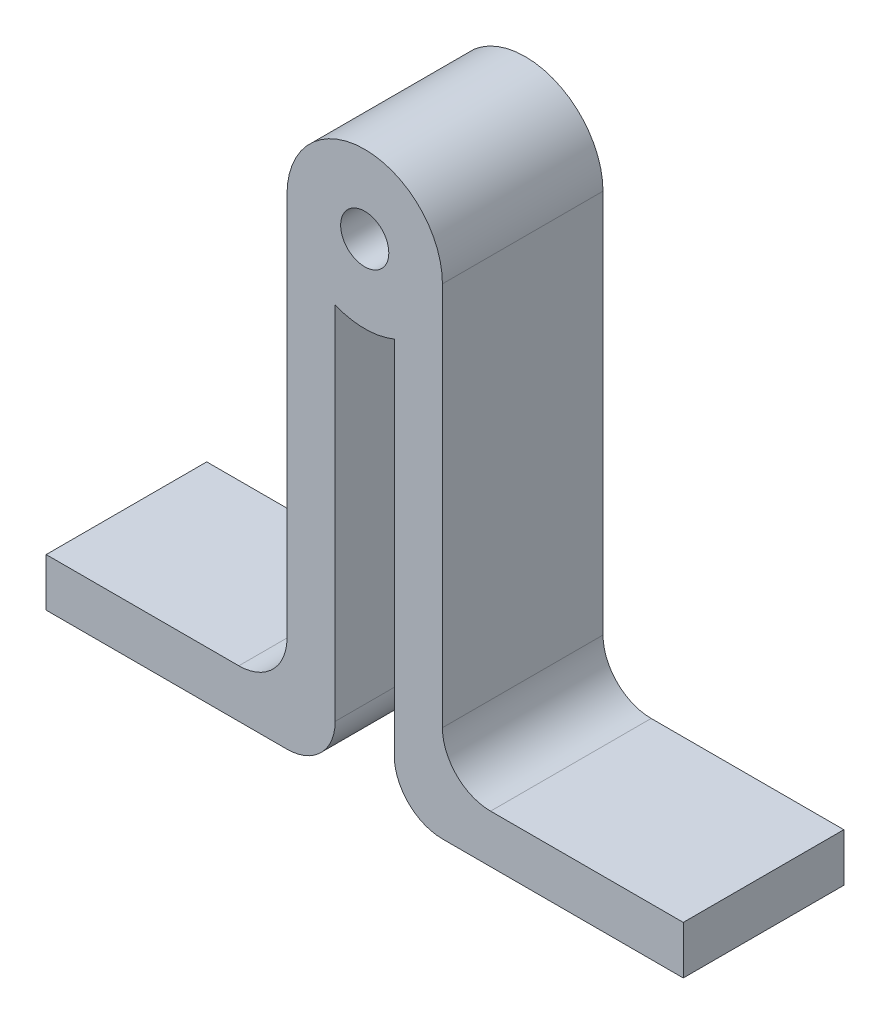
ISO-10303-21;
HEADER;
FILE_DESCRIPTION(('STEP AP214'),'2;1');
FILE_NAME('part.step','',(''),(''),'','','');
FILE_SCHEMA(('AUTOMOTIVE_DESIGN { 1 0 10303 214 1 1 1 1 }'));
ENDSEC;
DATA;
#1=APPLICATION_CONTEXT('core data for automotive mechanical design processes');
#2=APPLICATION_PROTOCOL_DEFINITION('international standard','automotive_design',2000,#1);
#3=PRODUCT_CONTEXT('',#1,'mechanical');
#4=PRODUCT('Part','Part','',(#3));
#5=PRODUCT_RELATED_PRODUCT_CATEGORY('part','',(#4));
#6=PRODUCT_DEFINITION_FORMATION('','',#4);
#7=PRODUCT_DEFINITION_CONTEXT('part definition',#1,'design');
#8=PRODUCT_DEFINITION('design','',#6,#7);
#9=PRODUCT_DEFINITION_SHAPE('','',#8);
#10=(LENGTH_UNIT() NAMED_UNIT(*) SI_UNIT(.MILLI.,.METRE.));
#11=(NAMED_UNIT(*) PLANE_ANGLE_UNIT() SI_UNIT($,.RADIAN.));
#12=(NAMED_UNIT(*) SI_UNIT($,.STERADIAN.) SOLID_ANGLE_UNIT());
#13=UNCERTAINTY_MEASURE_WITH_UNIT(LENGTH_MEASURE(1.E-05),#10,'distance_accuracy_value','');
#14=(GEOMETRIC_REPRESENTATION_CONTEXT(3) GLOBAL_UNCERTAINTY_ASSIGNED_CONTEXT((#13)) GLOBAL_UNIT_ASSIGNED_CONTEXT((#10,
#11,#12)) REPRESENTATION_CONTEXT('',''));
#15=CARTESIAN_POINT('',(0.,0.,0.));
#16=DIRECTION('',(0.,0.,1.));
#17=DIRECTION('',(1.,0.,0.));
#18=AXIS2_PLACEMENT_3D('',#15,#16,#17);
#19=CARTESIAN_POINT('',(1.84,0.,10.));
#20=DIRECTION('',(-1.,0.,0.));
#21=DIRECTION('',(0.,-1.,0.));
#22=AXIS2_PLACEMENT_3D('',#19,#20,#21);
#23=PLANE('',#22);
#24=DIRECTION('',(0.,1.,0.));
#25=VECTOR('',#24,1.);
#26=CARTESIAN_POINT('',(1.84,0.,0.));
#27=LINE('',#26,#25);
#28=CARTESIAN_POINT('',(1.84,-26.94,0.));
#29=VERTEX_POINT('',#28);
#30=CARTESIAN_POINT('',(1.84,-4.47660585711988,0.));
#31=VERTEX_POINT('',#30);
#32=EDGE_CURVE('E200',#29,#31,#27,.T.);
#33=ORIENTED_EDGE('',*,*,#32,.F.);
#34=DIRECTION('',(0.,0.,-1.));
#35=VECTOR('',#34,1.);
#36=CARTESIAN_POINT('',(1.84,-26.94,10.));
#37=LINE('',#36,#35);
#38=CARTESIAN_POINT('',(1.84,-26.94,10.));
#39=VERTEX_POINT('',#38);
#40=EDGE_CURVE('E11',#39,#29,#37,.T.);
#41=ORIENTED_EDGE('',*,*,#40,.F.);
#42=DIRECTION('',(0.,1.,0.));
#43=VECTOR('',#42,1.);
#44=CARTESIAN_POINT('',(1.84,0.,10.));
#45=LINE('',#44,#43);
#46=CARTESIAN_POINT('',(1.84,-4.47660585711988,10.));
#47=VERTEX_POINT('',#46);
#48=EDGE_CURVE('E258',#39,#47,#45,.T.);
#49=ORIENTED_EDGE('',*,*,#48,.T.);
#50=DIRECTION('',(0.,0.,-1.));
#51=VECTOR('',#50,1.);
#52=CARTESIAN_POINT('',(1.84,-4.47660585711988,10.));
#53=LINE('',#52,#51);
#54=EDGE_CURVE('E122',#47,#31,#53,.T.);
#55=ORIENTED_EDGE('',*,*,#54,.T.);
#56=EDGE_LOOP('',(#33,#41,#49,#55));
#57=FACE_BOUND('',#56,.T.);
#58=ADVANCED_FACE('F50',(#57),#23,.T.);
#59=CARTESIAN_POINT('',(4.84,-26.94,10.));
#60=DIRECTION('',(0.,0.,-1.));
#61=DIRECTION('',(-1.,0.,0.));
#62=AXIS2_PLACEMENT_3D('',#59,#60,#61);
#63=CYLINDRICAL_SURFACE('',#62,3.);
#64=CARTESIAN_POINT('',(4.84,-26.94,0.));
#65=DIRECTION('',(0.,0.,1.));
#66=DIRECTION('',(1.,0.,0.));
#67=AXIS2_PLACEMENT_3D('',#64,#65,#66);
#68=CIRCLE('',#67,3.);
#69=CARTESIAN_POINT('',(4.84,-29.94,0.));
#70=VERTEX_POINT('',#69);
#71=EDGE_CURVE('E205',#29,#70,#68,.T.);
#72=ORIENTED_EDGE('',*,*,#71,.T.);
#73=DIRECTION('',(0.,0.,-1.));
#74=VECTOR('',#73,1.);
#75=CARTESIAN_POINT('',(4.84,-29.94,10.));
#76=LINE('',#75,#74);
#77=CARTESIAN_POINT('',(4.84,-29.94,10.));
#78=VERTEX_POINT('',#77);
#79=EDGE_CURVE('E57',#78,#70,#76,.T.);
#80=ORIENTED_EDGE('',*,*,#79,.F.);
#81=CARTESIAN_POINT('',(4.84,-26.94,10.));
#82=DIRECTION('',(0.,0.,1.));
#83=DIRECTION('',(1.,0.,0.));
#84=AXIS2_PLACEMENT_3D('',#81,#82,#83);
#85=CIRCLE('',#84,3.);
#86=EDGE_CURVE('E317',#39,#78,#85,.T.);
#87=ORIENTED_EDGE('',*,*,#86,.F.);
#88=ORIENTED_EDGE('',*,*,#40,.T.);
#89=EDGE_LOOP('',(#72,#80,#87,#88));
#90=FACE_BOUND('',#89,.T.);
#91=ADVANCED_FACE('F304',(#90),#63,.T.);
#92=CARTESIAN_POINT('',(0.,-29.94,10.));
#93=DIRECTION('',(0.,-1.,0.));
#94=DIRECTION('',(1.,0.,0.));
#95=AXIS2_PLACEMENT_3D('',#92,#93,#94);
#96=PLANE('',#95);
#97=DIRECTION('',(-1.,0.,0.));
#98=VECTOR('',#97,1.);
#99=CARTESIAN_POINT('',(0.,-29.94,0.));
#100=LINE('',#99,#98);
#101=CARTESIAN_POINT('',(19.84,-29.94,0.));
#102=VERTEX_POINT('',#101);
#103=EDGE_CURVE('E207',#102,#70,#100,.T.);
#104=ORIENTED_EDGE('',*,*,#103,.F.);
#105=DIRECTION('',(0.,0.,-1.));
#106=VECTOR('',#105,1.);
#107=CARTESIAN_POINT('',(19.84,-29.94,10.));
#108=LINE('',#107,#106);
#109=CARTESIAN_POINT('',(19.84,-29.94,10.));
#110=VERTEX_POINT('',#109);
#111=EDGE_CURVE('E291',#110,#102,#108,.T.);
#112=ORIENTED_EDGE('',*,*,#111,.F.);
#113=DIRECTION('',(-1.,0.,0.));
#114=VECTOR('',#113,1.);
#115=CARTESIAN_POINT('',(0.,-29.94,10.));
#116=LINE('',#115,#114);
#117=EDGE_CURVE('E302',#110,#78,#116,.T.);
#118=ORIENTED_EDGE('',*,*,#117,.T.);
#119=ORIENTED_EDGE('',*,*,#79,.T.);
#120=EDGE_LOOP('',(#104,#112,#118,#119));
#121=FACE_BOUND('',#120,.T.);
#122=ADVANCED_FACE('F298',(#121),#96,.T.);
#123=CARTESIAN_POINT('',(19.84,0.,10.));
#124=DIRECTION('',(1.,0.,0.));
#125=DIRECTION('',(0.,0.,-1.));
#126=AXIS2_PLACEMENT_3D('',#123,#124,#125);
#127=PLANE('',#126);
#128=DIRECTION('',(0.,-1.,0.));
#129=VECTOR('',#128,1.);
#130=CARTESIAN_POINT('',(19.84,0.,0.));
#131=LINE('',#130,#129);
#132=CARTESIAN_POINT('',(19.84,-26.94,0.));
#133=VERTEX_POINT('',#132);
#134=EDGE_CURVE('E208',#133,#102,#131,.T.);
#135=ORIENTED_EDGE('',*,*,#134,.F.);
#136=DIRECTION('',(0.,0.,-1.));
#137=VECTOR('',#136,1.);
#138=CARTESIAN_POINT('',(19.84,-26.94,10.));
#139=LINE('',#138,#137);
#140=CARTESIAN_POINT('',(19.84,-26.94,10.));
#141=VERTEX_POINT('',#140);
#142=EDGE_CURVE('E288',#141,#133,#139,.T.);
#143=ORIENTED_EDGE('',*,*,#142,.F.);
#144=DIRECTION('',(0.,-1.,0.));
#145=VECTOR('',#144,1.);
#146=CARTESIAN_POINT('',(19.84,0.,10.));
#147=LINE('',#146,#145);
#148=EDGE_CURVE('E316',#141,#110,#147,.T.);
#149=ORIENTED_EDGE('',*,*,#148,.T.);
#150=ORIENTED_EDGE('',*,*,#111,.T.);
#151=EDGE_LOOP('',(#135,#143,#149,#150));
#152=FACE_BOUND('',#151,.T.);
#153=ADVANCED_FACE('F313',(#152),#127,.T.);
#154=CARTESIAN_POINT('',(0.,-26.94,10.));
#155=DIRECTION('',(0.,1.,0.));
#156=DIRECTION('',(0.,0.,1.));
#157=AXIS2_PLACEMENT_3D('',#154,#155,#156);
#158=PLANE('',#157);
#159=DIRECTION('',(1.,0.,0.));
#160=VECTOR('',#159,1.);
#161=CARTESIAN_POINT('',(0.,-26.94,0.));
#162=LINE('',#161,#160);
#163=CARTESIAN_POINT('',(7.84,-26.94,0.));
#164=VERTEX_POINT('',#163);
#165=EDGE_CURVE('E215',#164,#133,#162,.T.);
#166=ORIENTED_EDGE('',*,*,#165,.F.);
#167=DIRECTION('',(0.,0.,-1.));
#168=VECTOR('',#167,1.);
#169=CARTESIAN_POINT('',(7.84,-26.94,10.));
#170=LINE('',#169,#168);
#171=CARTESIAN_POINT('',(7.84,-26.94,10.));
#172=VERTEX_POINT('',#171);
#173=EDGE_CURVE('E289',#172,#164,#170,.T.);
#174=ORIENTED_EDGE('',*,*,#173,.F.);
#175=DIRECTION('',(1.,0.,0.));
#176=VECTOR('',#175,1.);
#177=CARTESIAN_POINT('',(0.,-26.94,10.));
#178=LINE('',#177,#176);
#179=EDGE_CURVE('E323',#172,#141,#178,.T.);
#180=ORIENTED_EDGE('',*,*,#179,.T.);
#181=ORIENTED_EDGE('',*,*,#142,.T.);
#182=EDGE_LOOP('',(#166,#174,#180,#181));
#183=FACE_BOUND('',#182,.T.);
#184=ADVANCED_FACE('F379',(#183),#158,.T.);
#185=CARTESIAN_POINT('',(7.84,-23.94,10.));
#186=DIRECTION('',(0.,0.,-1.));
#187=DIRECTION('',(-1.,0.,0.));
#188=AXIS2_PLACEMENT_3D('',#185,#186,#187);
#189=CYLINDRICAL_SURFACE('',#188,3.);
#190=CARTESIAN_POINT('',(7.84,-23.94,0.));
#191=DIRECTION('',(0.,0.,1.));
#192=DIRECTION('',(1.,0.,0.));
#193=AXIS2_PLACEMENT_3D('',#190,#191,#192);
#194=CIRCLE('',#193,3.);
#195=CARTESIAN_POINT('',(4.84,-23.94,0.));
#196=VERTEX_POINT('',#195);
#197=EDGE_CURVE('E216',#164,#196,#194,.F.);
#198=ORIENTED_EDGE('',*,*,#197,.T.);
#199=DIRECTION('',(0.,0.,-1.));
#200=VECTOR('',#199,1.);
#201=CARTESIAN_POINT('',(4.84,-23.94,10.));
#202=LINE('',#201,#200);
#203=CARTESIAN_POINT('',(4.84,-23.94,10.));
#204=VERTEX_POINT('',#203);
#205=EDGE_CURVE('E281',#204,#196,#202,.T.);
#206=ORIENTED_EDGE('',*,*,#205,.F.);
#207=CARTESIAN_POINT('',(7.84,-23.94,10.));
#208=DIRECTION('',(0.,0.,1.));
#209=DIRECTION('',(1.,0.,0.));
#210=AXIS2_PLACEMENT_3D('',#207,#208,#209);
#211=CIRCLE('',#210,3.);
#212=EDGE_CURVE('E332',#172,#204,#211,.F.);
#213=ORIENTED_EDGE('',*,*,#212,.F.);
#214=ORIENTED_EDGE('',*,*,#173,.T.);
#215=EDGE_LOOP('',(#198,#206,#213,#214));
#216=FACE_BOUND('',#215,.T.);
#217=ADVANCED_FACE('F378',(#216),#189,.F.);
#218=CARTESIAN_POINT('',(4.84,0.,10.));
#219=DIRECTION('',(1.,0.,0.));
#220=DIRECTION('',(0.,1.,0.));
#221=AXIS2_PLACEMENT_3D('',#218,#219,#220);
#222=PLANE('',#221);
#223=DIRECTION('',(0.,-1.,0.));
#224=VECTOR('',#223,1.);
#225=CARTESIAN_POINT('',(4.84,0.,0.));
#226=LINE('',#225,#224);
#227=CARTESIAN_POINT('',(4.84,0.,0.));
#228=VERTEX_POINT('',#227);
#229=EDGE_CURVE('E225',#228,#196,#226,.T.);
#230=ORIENTED_EDGE('',*,*,#229,.F.);
#231=DIRECTION('',(0.,0.,-1.));
#232=VECTOR('',#231,1.);
#233=CARTESIAN_POINT('',(4.84,0.,10.));
#234=LINE('',#233,#232);
#235=CARTESIAN_POINT('',(4.84,0.,10.));
#236=VERTEX_POINT('',#235);
#237=EDGE_CURVE('E282',#236,#228,#234,.T.);
#238=ORIENTED_EDGE('',*,*,#237,.F.);
#239=DIRECTION('',(0.,-1.,0.));
#240=VECTOR('',#239,1.);
#241=CARTESIAN_POINT('',(4.84,0.,10.));
#242=LINE('',#241,#240);
#243=EDGE_CURVE('E331',#236,#204,#242,.T.);
#244=ORIENTED_EDGE('',*,*,#243,.T.);
#245=ORIENTED_EDGE('',*,*,#205,.T.);
#246=EDGE_LOOP('',(#230,#238,#244,#245));
#247=FACE_BOUND('',#246,.T.);
#248=ADVANCED_FACE('F384',(#247),#222,.T.);
#249=CARTESIAN_POINT('',(0.,0.,10.));
#250=DIRECTION('',(0.,0.,-1.));
#251=DIRECTION('',(-1.,0.,0.));
#252=AXIS2_PLACEMENT_3D('',#249,#250,#251);
#253=CYLINDRICAL_SURFACE('',#252,4.84);
#254=CARTESIAN_POINT('',(0.,0.,0.));
#255=DIRECTION('',(0.,0.,1.));
#256=DIRECTION('',(1.,0.,0.));
#257=AXIS2_PLACEMENT_3D('',#254,#255,#256);
#258=CIRCLE('',#257,4.84);
#259=CARTESIAN_POINT('',(-4.84,0.,0.));
#260=VERTEX_POINT('',#259);
#261=EDGE_CURVE('E226',#228,#260,#258,.T.);
#262=ORIENTED_EDGE('',*,*,#261,.T.);
#263=DIRECTION('',(0.,0.,-1.));
#264=VECTOR('',#263,1.);
#265=CARTESIAN_POINT('',(-4.84,0.,10.));
#266=LINE('',#265,#264);
#267=CARTESIAN_POINT('',(-4.84,0.,10.));
#268=VERTEX_POINT('',#267);
#269=EDGE_CURVE('E280',#268,#260,#266,.T.);
#270=ORIENTED_EDGE('',*,*,#269,.F.);
#271=CARTESIAN_POINT('',(0.,0.,10.));
#272=DIRECTION('',(0.,0.,1.));
#273=DIRECTION('',(1.,0.,0.));
#274=AXIS2_PLACEMENT_3D('',#271,#272,#273);
#275=CIRCLE('',#274,4.84);
#276=EDGE_CURVE('E336',#236,#268,#275,.T.);
#277=ORIENTED_EDGE('',*,*,#276,.F.);
#278=ORIENTED_EDGE('',*,*,#237,.T.);
#279=EDGE_LOOP('',(#262,#270,#277,#278));
#280=FACE_BOUND('',#279,.T.);
#281=ADVANCED_FACE('F390',(#280),#253,.T.);
#282=CARTESIAN_POINT('',(-4.84,0.,10.));
#283=DIRECTION('',(1.,0.,0.));
#284=DIRECTION('',(0.,1.,0.));
#285=AXIS2_PLACEMENT_3D('',#282,#283,#284);
#286=PLANE('',#285);
#287=DIRECTION('',(0.,-1.,0.));
#288=VECTOR('',#287,1.);
#289=CARTESIAN_POINT('',(-4.84,0.,0.));
#290=LINE('',#289,#288);
#291=CARTESIAN_POINT('',(-4.84,-23.94,0.));
#292=VERTEX_POINT('',#291);
#293=EDGE_CURVE('E227',#260,#292,#290,.T.);
#294=ORIENTED_EDGE('',*,*,#293,.T.);
#295=DIRECTION('',(0.,0.,-1.));
#296=VECTOR('',#295,1.);
#297=CARTESIAN_POINT('',(-4.84,-23.94,10.));
#298=LINE('',#297,#296);
#299=CARTESIAN_POINT('',(-4.84,-23.94,10.));
#300=VERTEX_POINT('',#299);
#301=EDGE_CURVE('E272',#300,#292,#298,.T.);
#302=ORIENTED_EDGE('',*,*,#301,.F.);
#303=DIRECTION('',(0.,-1.,0.));
#304=VECTOR('',#303,1.);
#305=CARTESIAN_POINT('',(-4.84,0.,10.));
#306=LINE('',#305,#304);
#307=EDGE_CURVE('E342',#268,#300,#306,.T.);
#308=ORIENTED_EDGE('',*,*,#307,.F.);
#309=ORIENTED_EDGE('',*,*,#269,.T.);
#310=EDGE_LOOP('',(#294,#302,#308,#309));
#311=FACE_BOUND('',#310,.T.);
#312=ADVANCED_FACE('F388',(#311),#286,.F.);
#313=CARTESIAN_POINT('',(-7.84,-23.94,10.));
#314=DIRECTION('',(0.,0.,-1.));
#315=DIRECTION('',(-1.,0.,0.));
#316=AXIS2_PLACEMENT_3D('',#313,#314,#315);
#317=CYLINDRICAL_SURFACE('',#316,3.);
#318=CARTESIAN_POINT('',(-7.84,-23.94,0.));
#319=DIRECTION('',(0.,0.,1.));
#320=DIRECTION('',(1.,0.,0.));
#321=AXIS2_PLACEMENT_3D('',#318,#319,#320);
#322=CIRCLE('',#321,3.);
#323=CARTESIAN_POINT('',(-7.84,-26.94,0.));
#324=VERTEX_POINT('',#323);
#325=EDGE_CURVE('E233',#324,#292,#322,.T.);
#326=ORIENTED_EDGE('',*,*,#325,.F.);
#327=DIRECTION('',(0.,0.,-1.));
#328=VECTOR('',#327,1.);
#329=CARTESIAN_POINT('',(-7.84,-26.94,10.));
#330=LINE('',#329,#328);
#331=CARTESIAN_POINT('',(-7.84,-26.94,10.));
#332=VERTEX_POINT('',#331);
#333=EDGE_CURVE('E271',#332,#324,#330,.T.);
#334=ORIENTED_EDGE('',*,*,#333,.F.);
#335=CARTESIAN_POINT('',(-7.84,-23.94,10.));
#336=DIRECTION('',(0.,0.,1.));
#337=DIRECTION('',(1.,0.,0.));
#338=AXIS2_PLACEMENT_3D('',#335,#336,#337);
#339=CIRCLE('',#338,3.);
#340=EDGE_CURVE('E341',#332,#300,#339,.T.);
#341=ORIENTED_EDGE('',*,*,#340,.T.);
#342=ORIENTED_EDGE('',*,*,#301,.T.);
#343=EDGE_LOOP('',(#326,#334,#341,#342));
#344=FACE_BOUND('',#343,.T.);
#345=ADVANCED_FACE('F391',(#344),#317,.F.);
#346=CARTESIAN_POINT('',(0.,-26.94,10.));
#347=DIRECTION('',(0.,-1.,0.));
#348=DIRECTION('',(0.,0.,-1.));
#349=AXIS2_PLACEMENT_3D('',#346,#347,#348);
#350=PLANE('',#349);
#351=DIRECTION('',(-1.,0.,0.));
#352=VECTOR('',#351,1.);
#353=CARTESIAN_POINT('',(0.,-26.94,0.));
#354=LINE('',#353,#352);
#355=CARTESIAN_POINT('',(-19.84,-26.94,0.));
#356=VERTEX_POINT('',#355);
#357=EDGE_CURVE('E239',#324,#356,#354,.T.);
#358=ORIENTED_EDGE('',*,*,#357,.T.);
#359=DIRECTION('',(0.,0.,-1.));
#360=VECTOR('',#359,1.);
#361=CARTESIAN_POINT('',(-19.84,-26.94,10.));
#362=LINE('',#361,#360);
#363=CARTESIAN_POINT('',(-19.84,-26.94,10.));
#364=VERTEX_POINT('',#363);
#365=EDGE_CURVE('E270',#364,#356,#362,.T.);
#366=ORIENTED_EDGE('',*,*,#365,.F.);
#367=DIRECTION('',(-1.,0.,0.));
#368=VECTOR('',#367,1.);
#369=CARTESIAN_POINT('',(0.,-26.94,10.));
#370=LINE('',#369,#368);
#371=EDGE_CURVE('E346',#332,#364,#370,.T.);
#372=ORIENTED_EDGE('',*,*,#371,.F.);
#373=ORIENTED_EDGE('',*,*,#333,.T.);
#374=EDGE_LOOP('',(#358,#366,#372,#373));
#375=FACE_BOUND('',#374,.T.);
#376=ADVANCED_FACE('F400',(#375),#350,.F.);
#377=CARTESIAN_POINT('',(-19.84,0.,10.));
#378=DIRECTION('',(1.,0.,0.));
#379=DIRECTION('',(0.,0.,-1.));
#380=AXIS2_PLACEMENT_3D('',#377,#378,#379);
#381=PLANE('',#380);
#382=DIRECTION('',(0.,-1.,0.));
#383=VECTOR('',#382,1.);
#384=CARTESIAN_POINT('',(-19.84,0.,0.));
#385=LINE('',#384,#383);
#386=CARTESIAN_POINT('',(-19.84,-29.94,0.));
#387=VERTEX_POINT('',#386);
#388=EDGE_CURVE('E242',#356,#387,#385,.T.);
#389=ORIENTED_EDGE('',*,*,#388,.T.);
#390=DIRECTION('',(0.,0.,-1.));
#391=VECTOR('',#390,1.);
#392=CARTESIAN_POINT('',(-19.84,-29.94,10.));
#393=LINE('',#392,#391);
#394=CARTESIAN_POINT('',(-19.84,-29.94,10.));
#395=VERTEX_POINT('',#394);
#396=EDGE_CURVE('E261',#395,#387,#393,.T.);
#397=ORIENTED_EDGE('',*,*,#396,.F.);
#398=DIRECTION('',(0.,-1.,0.));
#399=VECTOR('',#398,1.);
#400=CARTESIAN_POINT('',(-19.84,0.,10.));
#401=LINE('',#400,#399);
#402=EDGE_CURVE('E189',#364,#395,#401,.T.);
#403=ORIENTED_EDGE('',*,*,#402,.F.);
#404=ORIENTED_EDGE('',*,*,#365,.T.);
#405=EDGE_LOOP('',(#389,#397,#403,#404));
#406=FACE_BOUND('',#405,.T.);
#407=ADVANCED_FACE('F360',(#406),#381,.F.);
#408=CARTESIAN_POINT('',(0.,-29.94,10.));
#409=DIRECTION('',(0.,1.,0.));
#410=DIRECTION('',(0.,0.,1.));
#411=AXIS2_PLACEMENT_3D('',#408,#409,#410);
#412=PLANE('',#411);
#413=DIRECTION('',(1.,0.,0.));
#414=VECTOR('',#413,1.);
#415=CARTESIAN_POINT('',(0.,-29.94,0.));
#416=LINE('',#415,#414);
#417=CARTESIAN_POINT('',(-4.84,-29.94,0.));
#418=VERTEX_POINT('',#417);
#419=EDGE_CURVE('E241',#387,#418,#416,.T.);
#420=ORIENTED_EDGE('',*,*,#419,.T.);
#421=DIRECTION('',(0.,0.,-1.));
#422=VECTOR('',#421,1.);
#423=CARTESIAN_POINT('',(-4.84,-29.94,10.));
#424=LINE('',#423,#422);
#425=CARTESIAN_POINT('',(-4.84,-29.94,10.));
#426=VERTEX_POINT('',#425);
#427=EDGE_CURVE('E172',#426,#418,#424,.T.);
#428=ORIENTED_EDGE('',*,*,#427,.F.);
#429=DIRECTION('',(1.,0.,0.));
#430=VECTOR('',#429,1.);
#431=CARTESIAN_POINT('',(0.,-29.94,10.));
#432=LINE('',#431,#430);
#433=EDGE_CURVE('E184',#395,#426,#432,.T.);
#434=ORIENTED_EDGE('',*,*,#433,.F.);
#435=ORIENTED_EDGE('',*,*,#396,.T.);
#436=EDGE_LOOP('',(#420,#428,#434,#435));
#437=FACE_BOUND('',#436,.T.);
#438=ADVANCED_FACE('F361',(#437),#412,.F.);
#439=CARTESIAN_POINT('',(-4.84,-26.94,10.));
#440=DIRECTION('',(0.,0.,-1.));
#441=DIRECTION('',(-1.,0.,0.));
#442=AXIS2_PLACEMENT_3D('',#439,#440,#441);
#443=CYLINDRICAL_SURFACE('',#442,3.);
#444=CARTESIAN_POINT('',(-4.84,-26.94,0.));
#445=DIRECTION('',(0.,0.,1.));
#446=DIRECTION('',(1.,0.,0.));
#447=AXIS2_PLACEMENT_3D('',#444,#445,#446);
#448=CIRCLE('',#447,3.);
#449=CARTESIAN_POINT('',(-1.84,-26.94,0.));
#450=VERTEX_POINT('',#449);
#451=EDGE_CURVE('E171',#450,#418,#448,.F.);
#452=ORIENTED_EDGE('',*,*,#451,.F.);
#453=DIRECTION('',(0.,0.,-1.));
#454=VECTOR('',#453,1.);
#455=CARTESIAN_POINT('',(-1.84,-26.94,10.));
#456=LINE('',#455,#454);
#457=CARTESIAN_POINT('',(-1.84,-26.94,10.));
#458=VERTEX_POINT('',#457);
#459=EDGE_CURVE('E167',#458,#450,#456,.T.);
#460=ORIENTED_EDGE('',*,*,#459,.F.);
#461=CARTESIAN_POINT('',(-4.84,-26.94,10.));
#462=DIRECTION('',(0.,0.,1.));
#463=DIRECTION('',(1.,0.,0.));
#464=AXIS2_PLACEMENT_3D('',#461,#462,#463);
#465=CIRCLE('',#464,3.);
#466=EDGE_CURVE('E173',#458,#426,#465,.F.);
#467=ORIENTED_EDGE('',*,*,#466,.T.);
#468=ORIENTED_EDGE('',*,*,#427,.T.);
#469=EDGE_LOOP('',(#452,#460,#467,#468));
#470=FACE_BOUND('',#469,.T.);
#471=ADVANCED_FACE('F170',(#470),#443,.T.);
#472=CARTESIAN_POINT('',(-1.84,0.,10.));
#473=DIRECTION('',(-1.,0.,0.));
#474=DIRECTION('',(0.,0.,1.));
#475=AXIS2_PLACEMENT_3D('',#472,#473,#474);
#476=PLANE('',#475);
#477=DIRECTION('',(0.,1.,0.));
#478=VECTOR('',#477,1.);
#479=CARTESIAN_POINT('',(-1.84,0.,0.));
#480=LINE('',#479,#478);
#481=CARTESIAN_POINT('',(-1.84,-4.47660585711988,0.));
#482=VERTEX_POINT('',#481);
#483=EDGE_CURVE('E113',#450,#482,#480,.T.);
#484=ORIENTED_EDGE('',*,*,#483,.T.);
#485=DIRECTION('',(0.,0.,-1.));
#486=VECTOR('',#485,1.);
#487=CARTESIAN_POINT('',(-1.84,-4.47660585711988,10.));
#488=LINE('',#487,#486);
#489=CARTESIAN_POINT('',(-1.84,-4.47660585711988,10.));
#490=VERTEX_POINT('',#489);
#491=EDGE_CURVE('E176',#490,#482,#488,.T.);
#492=ORIENTED_EDGE('',*,*,#491,.F.);
#493=DIRECTION('',(0.,1.,0.));
#494=VECTOR('',#493,1.);
#495=CARTESIAN_POINT('',(-1.84,0.,10.));
#496=LINE('',#495,#494);
#497=EDGE_CURVE('E178',#458,#490,#496,.T.);
#498=ORIENTED_EDGE('',*,*,#497,.F.);
#499=ORIENTED_EDGE('',*,*,#459,.T.);
#500=EDGE_LOOP('',(#484,#492,#498,#499));
#501=FACE_BOUND('',#500,.T.);
#502=ADVANCED_FACE('F177',(#501),#476,.F.);
#503=EDGE_CURVE('E229',#482,#31,#258,.T.);
#504=ORIENTED_EDGE('',*,*,#503,.T.);
#505=ORIENTED_EDGE('',*,*,#54,.F.);
#506=EDGE_CURVE('E61',#490,#47,#275,.T.);
#507=ORIENTED_EDGE('',*,*,#506,.F.);
#508=ORIENTED_EDGE('',*,*,#491,.T.);
#509=EDGE_LOOP('',(#504,#505,#507,#508));
#510=FACE_BOUND('',#509,.T.);
#511=ADVANCED_FACE('F409',(#510),#253,.T.);
#512=CARTESIAN_POINT('',(0.,0.,10.));
#513=DIRECTION('',(0.,0.,-1.));
#514=DIRECTION('',(-1.,0.,0.));
#515=AXIS2_PLACEMENT_3D('',#512,#513,#514);
#516=CYLINDRICAL_SURFACE('',#515,1.5);
#517=CARTESIAN_POINT('',(0.,0.,10.));
#518=DIRECTION('',(0.,0.,1.));
#519=DIRECTION('',(1.,0.,0.));
#520=AXIS2_PLACEMENT_3D('',#517,#518,#519);
#521=CIRCLE('',#520,1.5);
#522=CARTESIAN_POINT('',(1.5,0.,10.));
#523=VERTEX_POINT('',#522);
#524=EDGE_CURVE('E191',#523,#523,#521,.T.);
#525=ORIENTED_EDGE('',*,*,#524,.T.);
#526=EDGE_LOOP('',(#525));
#527=FACE_BOUND('',#526,.T.);
#528=CARTESIAN_POINT('',(0.,0.,0.));
#529=DIRECTION('',(0.,0.,1.));
#530=DIRECTION('',(1.,0.,0.));
#531=AXIS2_PLACEMENT_3D('',#528,#529,#530);
#532=CIRCLE('',#531,1.5);
#533=CARTESIAN_POINT('',(1.5,0.,0.));
#534=VERTEX_POINT('',#533);
#535=EDGE_CURVE('E254',#534,#534,#532,.T.);
#536=ORIENTED_EDGE('',*,*,#535,.F.);
#537=EDGE_LOOP('',(#536));
#538=FACE_BOUND('',#537,.T.);
#539=ADVANCED_FACE('F412',(#527,#538),#516,.F.);
#540=CARTESIAN_POINT('',(0.,0.,10.));
#541=DIRECTION('',(0.,0.,1.));
#542=DIRECTION('',(1.,0.,0.));
#543=AXIS2_PLACEMENT_3D('',#540,#541,#542);
#544=PLANE('',#543);
#545=ORIENTED_EDGE('',*,*,#48,.F.);
#546=ORIENTED_EDGE('',*,*,#86,.T.);
#547=ORIENTED_EDGE('',*,*,#117,.F.);
#548=ORIENTED_EDGE('',*,*,#148,.F.);
#549=ORIENTED_EDGE('',*,*,#179,.F.);
#550=ORIENTED_EDGE('',*,*,#212,.T.);
#551=ORIENTED_EDGE('',*,*,#243,.F.);
#552=ORIENTED_EDGE('',*,*,#276,.T.);
#553=ORIENTED_EDGE('',*,*,#307,.T.);
#554=ORIENTED_EDGE('',*,*,#340,.F.);
#555=ORIENTED_EDGE('',*,*,#371,.T.);
#556=ORIENTED_EDGE('',*,*,#402,.T.);
#557=ORIENTED_EDGE('',*,*,#433,.T.);
#558=ORIENTED_EDGE('',*,*,#466,.F.);
#559=ORIENTED_EDGE('',*,*,#497,.T.);
#560=ORIENTED_EDGE('',*,*,#506,.T.);
#561=EDGE_LOOP('',(#545,#546,#547,#548,#549,#550,#551,#552,#553,#554,#555,#556,#557,#558,#559,#560));
#562=FACE_BOUND('',#561,.T.);
#563=ORIENTED_EDGE('',*,*,#524,.F.);
#564=EDGE_LOOP('',(#563));
#565=FACE_BOUND('',#564,.T.);
#566=ADVANCED_FACE('F185',(#562,#565),#544,.T.);
#567=CARTESIAN_POINT('',(0.,0.,0.));
#568=DIRECTION('',(0.,0.,1.));
#569=DIRECTION('',(1.,0.,0.));
#570=AXIS2_PLACEMENT_3D('',#567,#568,#569);
#571=PLANE('',#570);
#572=ORIENTED_EDGE('',*,*,#32,.T.);
#573=ORIENTED_EDGE('',*,*,#503,.F.);
#574=ORIENTED_EDGE('',*,*,#483,.F.);
#575=ORIENTED_EDGE('',*,*,#451,.T.);
#576=ORIENTED_EDGE('',*,*,#419,.F.);
#577=ORIENTED_EDGE('',*,*,#388,.F.);
#578=ORIENTED_EDGE('',*,*,#357,.F.);
#579=ORIENTED_EDGE('',*,*,#325,.T.);
#580=ORIENTED_EDGE('',*,*,#293,.F.);
#581=ORIENTED_EDGE('',*,*,#261,.F.);
#582=ORIENTED_EDGE('',*,*,#229,.T.);
#583=ORIENTED_EDGE('',*,*,#197,.F.);
#584=ORIENTED_EDGE('',*,*,#165,.T.);
#585=ORIENTED_EDGE('',*,*,#134,.T.);
#586=ORIENTED_EDGE('',*,*,#103,.T.);
#587=ORIENTED_EDGE('',*,*,#71,.F.);
#588=EDGE_LOOP('',(#572,#573,#574,#575,#576,#577,#578,#579,#580,#581,#582,#583,#584,#585,#586,#587));
#589=FACE_BOUND('',#588,.T.);
#590=ORIENTED_EDGE('',*,*,#535,.T.);
#591=EDGE_LOOP('',(#590));
#592=FACE_BOUND('',#591,.T.);
#593=ADVANCED_FACE('F310',(#589,#592),#571,.F.);
#594=CLOSED_SHELL('',(#58,#91,#122,#153,#184,#217,#248,#281,#312,#345,#376,#407,#438,#471,#502,
#511,#539,#566,#593));
#595=MANIFOLD_SOLID_BREP('B2',#594);
#596=ADVANCED_BREP_SHAPE_REPRESENTATION('',(#18,#595),#14);
#597=SHAPE_DEFINITION_REPRESENTATION(#9,#596);
ENDSEC;
END-ISO-10303-21;
